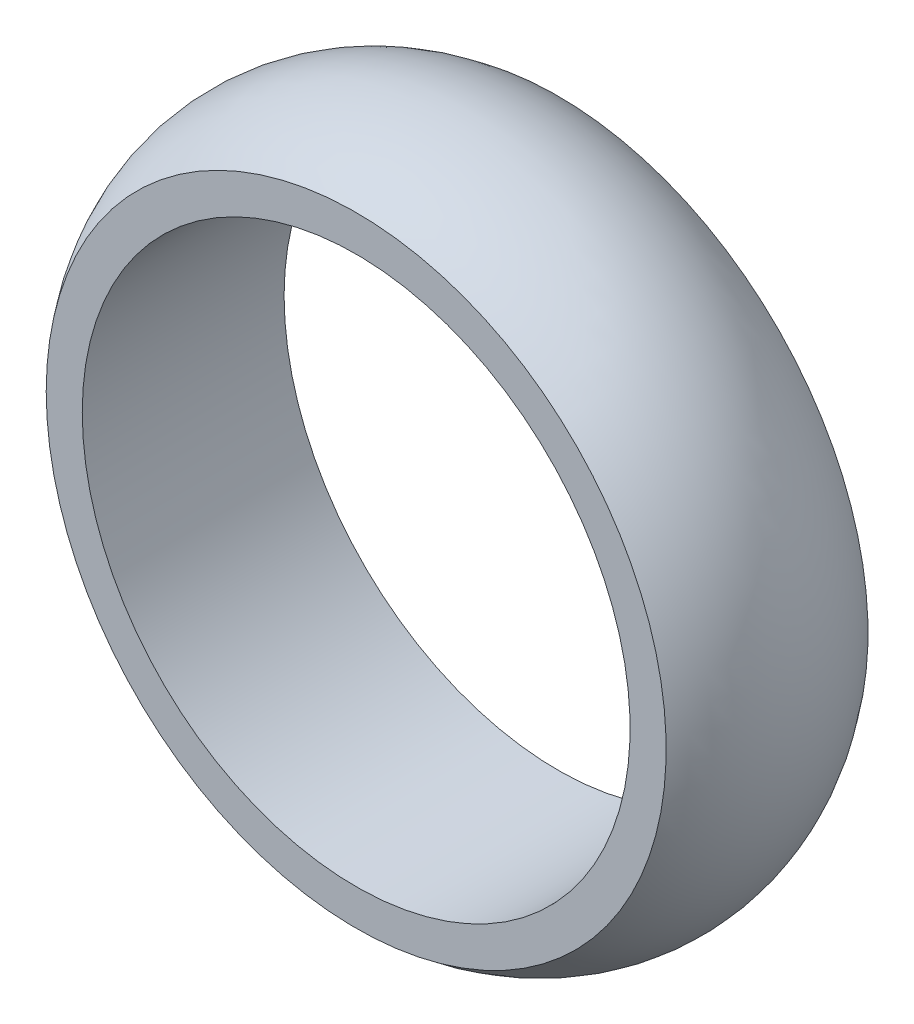
ISO-10303-21;
HEADER;
FILE_DESCRIPTION(('STEP AP214'),'2;1');
FILE_NAME('part.step','',(''),(''),'','','');
FILE_SCHEMA(('AUTOMOTIVE_DESIGN { 1 0 10303 214 1 1 1 1 }'));
ENDSEC;
DATA;
#1=APPLICATION_CONTEXT('core data for automotive mechanical design processes');
#2=APPLICATION_PROTOCOL_DEFINITION('international standard','automotive_design',2000,#1);
#3=PRODUCT_CONTEXT('',#1,'mechanical');
#4=PRODUCT('Part','Part','',(#3));
#5=PRODUCT_RELATED_PRODUCT_CATEGORY('part','',(#4));
#6=PRODUCT_DEFINITION_FORMATION('','',#4);
#7=PRODUCT_DEFINITION_CONTEXT('part definition',#1,'design');
#8=PRODUCT_DEFINITION('design','',#6,#7);
#9=PRODUCT_DEFINITION_SHAPE('','',#8);
#10=(LENGTH_UNIT() NAMED_UNIT(*) SI_UNIT(.MILLI.,.METRE.));
#11=(NAMED_UNIT(*) PLANE_ANGLE_UNIT() SI_UNIT($,.RADIAN.));
#12=(NAMED_UNIT(*) SI_UNIT($,.STERADIAN.) SOLID_ANGLE_UNIT());
#13=UNCERTAINTY_MEASURE_WITH_UNIT(LENGTH_MEASURE(1.E-05),#10,'distance_accuracy_value','');
#14=(GEOMETRIC_REPRESENTATION_CONTEXT(3) GLOBAL_UNCERTAINTY_ASSIGNED_CONTEXT((#13)) GLOBAL_UNIT_ASSIGNED_CONTEXT((#10,
#11,#12)) REPRESENTATION_CONTEXT('',''));
#15=CARTESIAN_POINT('',(0.,0.,0.));
#16=DIRECTION('',(0.,0.,1.));
#17=DIRECTION('',(1.,0.,0.));
#18=AXIS2_PLACEMENT_3D('',#15,#16,#17);
#19=CARTESIAN_POINT('',(0.,0.,-8.7081370001519));
#20=DIRECTION('',(0.,0.,-1.));
#21=DIRECTION('',(-1.,0.,0.));
#22=AXIS2_PLACEMENT_3D('',#19,#20,#21);
#23=CYLINDRICAL_SURFACE('',#22,9.5);
#24=CARTESIAN_POINT('',(0.,0.,-3.5));
#25=DIRECTION('',(0.,0.,-1.));
#26=DIRECTION('',(-1.,0.,0.));
#27=AXIS2_PLACEMENT_3D('',#24,#25,#26);
#28=CIRCLE('',#27,9.5);
#29=CARTESIAN_POINT('',(-9.5,0.,-3.5));
#30=VERTEX_POINT('',#29);
#31=EDGE_CURVE('E51',#30,#30,#28,.T.);
#32=ORIENTED_EDGE('',*,*,#31,.T.);
#33=EDGE_LOOP('',(#32));
#34=FACE_BOUND('',#33,.T.);
#35=CARTESIAN_POINT('',(0.,0.,3.5));
#36=DIRECTION('',(0.,0.,-1.));
#37=DIRECTION('',(-1.,0.,0.));
#38=AXIS2_PLACEMENT_3D('',#35,#36,#37);
#39=CIRCLE('',#38,9.5);
#40=CARTESIAN_POINT('',(-9.5,0.,3.5));
#41=VERTEX_POINT('',#40);
#42=EDGE_CURVE('E10',#41,#41,#39,.T.);
#43=ORIENTED_EDGE('',*,*,#42,.F.);
#44=EDGE_LOOP('',(#43));
#45=FACE_BOUND('',#44,.T.);
#46=ADVANCED_FACE('F37',(#34,#45),#23,.F.);
#47=CARTESIAN_POINT('',(-9.5,0.,3.5));
#48=DIRECTION('',(0.,0.,1.));
#49=DIRECTION('',(1.,0.,0.));
#50=AXIS2_PLACEMENT_3D('',#47,#48,#49);
#51=PLANE('',#50);
#52=ORIENTED_EDGE('',*,*,#42,.T.);
#53=EDGE_LOOP('',(#52));
#54=FACE_BOUND('',#53,.T.);
#55=CARTESIAN_POINT('',(0.,0.,3.5));
#56=DIRECTION('',(0.,0.,-1.));
#57=DIRECTION('',(-1.,0.,0.));
#58=AXIS2_PLACEMENT_3D('',#55,#56,#57);
#59=CIRCLE('',#58,10.75);
#60=CARTESIAN_POINT('',(-10.75,0.,3.5));
#61=VERTEX_POINT('',#60);
#62=EDGE_CURVE('E43',#61,#61,#59,.T.);
#63=ORIENTED_EDGE('',*,*,#62,.F.);
#64=EDGE_LOOP('',(#63));
#65=FACE_BOUND('',#64,.T.);
#66=ADVANCED_FACE('F67',(#54,#65),#51,.T.);
#67=CARTESIAN_POINT('',(0.,0.,0.));
#68=DIRECTION('',(0.,0.,-1.));
#69=DIRECTION('',(-1.,0.,0.));
#70=AXIS2_PLACEMENT_3D('',#67,#68,#69);
#71=TOROIDAL_SURFACE('',#70,6.475,5.525);
#72=ORIENTED_EDGE('',*,*,#62,.T.);
#73=EDGE_LOOP('',(#72));
#74=FACE_BOUND('',#73,.T.);
#75=CARTESIAN_POINT('',(0.,0.,-3.5));
#76=DIRECTION('',(0.,0.,-1.));
#77=DIRECTION('',(-1.,0.,0.));
#78=AXIS2_PLACEMENT_3D('',#75,#76,#77);
#79=CIRCLE('',#78,10.75);
#80=CARTESIAN_POINT('',(-10.75,0.,-3.5));
#81=VERTEX_POINT('',#80);
#82=EDGE_CURVE('E47',#81,#81,#79,.T.);
#83=ORIENTED_EDGE('',*,*,#82,.F.);
#84=EDGE_LOOP('',(#83));
#85=FACE_BOUND('',#84,.T.);
#86=ADVANCED_FACE('F61',(#74,#85),#71,.T.);
#87=CARTESIAN_POINT('',(-9.5,0.,-3.5));
#88=DIRECTION('',(0.,0.,-1.));
#89=DIRECTION('',(-1.,0.,0.));
#90=AXIS2_PLACEMENT_3D('',#87,#88,#89);
#91=PLANE('',#90);
#92=ORIENTED_EDGE('',*,*,#82,.T.);
#93=EDGE_LOOP('',(#92));
#94=FACE_BOUND('',#93,.T.);
#95=ORIENTED_EDGE('',*,*,#31,.F.);
#96=EDGE_LOOP('',(#95));
#97=FACE_BOUND('',#96,.T.);
#98=ADVANCED_FACE('F59',(#94,#97),#91,.T.);
#99=CLOSED_SHELL('',(#46,#66,#86,#98));
#100=MANIFOLD_SOLID_BREP('B2',#99);
#101=ADVANCED_BREP_SHAPE_REPRESENTATION('',(#18,#100),#14);
#102=SHAPE_DEFINITION_REPRESENTATION(#9,#101);
ENDSEC;
END-ISO-10303-21;
